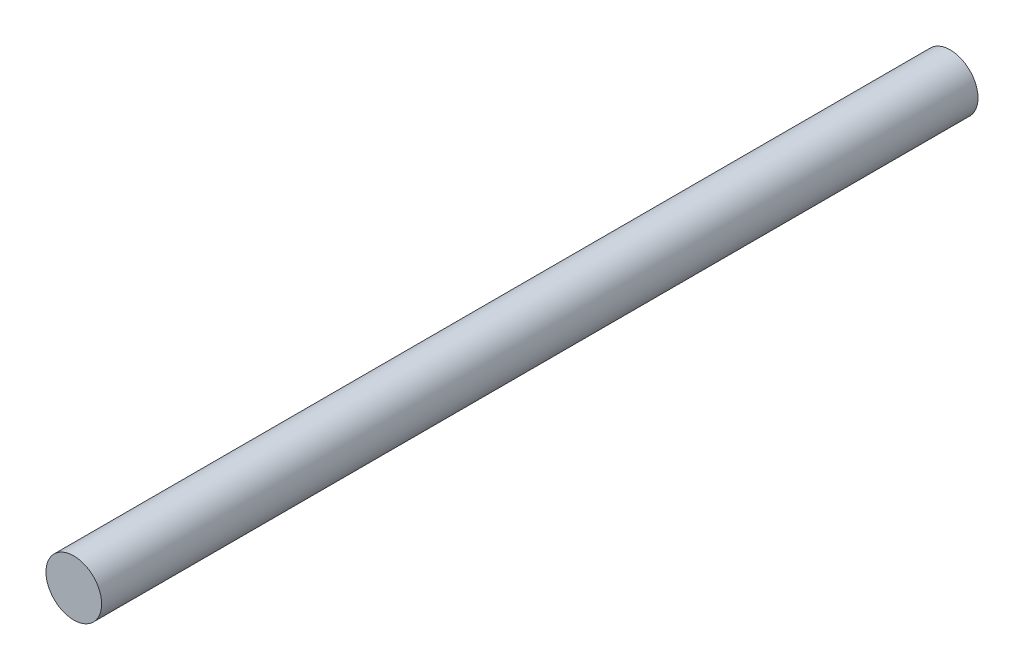
ISO-10303-21;
HEADER;
FILE_DESCRIPTION(('STEP AP214'),'2;1');
FILE_NAME('part.step','',(''),(''),'','','');
FILE_SCHEMA(('AUTOMOTIVE_DESIGN { 1 0 10303 214 1 1 1 1 }'));
ENDSEC;
DATA;
#1=APPLICATION_CONTEXT('core data for automotive mechanical design processes');
#2=APPLICATION_PROTOCOL_DEFINITION('international standard','automotive_design',2000,#1);
#3=PRODUCT_CONTEXT('',#1,'mechanical');
#4=PRODUCT('Part','Part','',(#3));
#5=PRODUCT_RELATED_PRODUCT_CATEGORY('part','',(#4));
#6=PRODUCT_DEFINITION_FORMATION('','',#4);
#7=PRODUCT_DEFINITION_CONTEXT('part definition',#1,'design');
#8=PRODUCT_DEFINITION('design','',#6,#7);
#9=PRODUCT_DEFINITION_SHAPE('','',#8);
#10=(LENGTH_UNIT() NAMED_UNIT(*) SI_UNIT(.MILLI.,.METRE.));
#11=(NAMED_UNIT(*) PLANE_ANGLE_UNIT() SI_UNIT($,.RADIAN.));
#12=(NAMED_UNIT(*) SI_UNIT($,.STERADIAN.) SOLID_ANGLE_UNIT());
#13=UNCERTAINTY_MEASURE_WITH_UNIT(LENGTH_MEASURE(1.E-05),#10,'distance_accuracy_value','');
#14=(GEOMETRIC_REPRESENTATION_CONTEXT(3) GLOBAL_UNCERTAINTY_ASSIGNED_CONTEXT((#13)) GLOBAL_UNIT_ASSIGNED_CONTEXT((#10,
#11,#12)) REPRESENTATION_CONTEXT('',''));
#15=CARTESIAN_POINT('',(0.,0.,0.));
#16=DIRECTION('',(0.,0.,1.));
#17=DIRECTION('',(1.,0.,0.));
#18=AXIS2_PLACEMENT_3D('',#15,#16,#17);
#19=CARTESIAN_POINT('',(0.,0.,63.));
#20=DIRECTION('',(0.,0.,-1.));
#21=DIRECTION('',(-1.,0.,0.));
#22=AXIS2_PLACEMENT_3D('',#19,#20,#21);
#23=CYLINDRICAL_SURFACE('',#22,2.);
#24=CARTESIAN_POINT('',(0.,0.,63.));
#25=DIRECTION('',(0.,0.,1.));
#26=DIRECTION('',(1.,0.,0.));
#27=AXIS2_PLACEMENT_3D('',#24,#25,#26);
#28=CIRCLE('',#27,2.);
#29=CARTESIAN_POINT('',(2.,0.,63.));
#30=VERTEX_POINT('',#29);
#31=EDGE_CURVE('E10',#30,#30,#28,.T.);
#32=ORIENTED_EDGE('',*,*,#31,.F.);
#33=EDGE_LOOP('',(#32));
#34=FACE_BOUND('',#33,.T.);
#35=CARTESIAN_POINT('',(0.,0.,0.));
#36=DIRECTION('',(0.,0.,1.));
#37=DIRECTION('',(1.,0.,0.));
#38=AXIS2_PLACEMENT_3D('',#35,#36,#37);
#39=CIRCLE('',#38,2.);
#40=CARTESIAN_POINT('',(2.,0.,0.));
#41=VERTEX_POINT('',#40);
#42=EDGE_CURVE('E44',#41,#41,#39,.T.);
#43=ORIENTED_EDGE('',*,*,#42,.T.);
#44=EDGE_LOOP('',(#43));
#45=FACE_BOUND('',#44,.T.);
#46=ADVANCED_FACE('F41',(#34,#45),#23,.T.);
#47=CARTESIAN_POINT('',(0.,0.,63.));
#48=DIRECTION('',(0.,0.,1.));
#49=DIRECTION('',(1.,0.,0.));
#50=AXIS2_PLACEMENT_3D('',#47,#48,#49);
#51=PLANE('',#50);
#52=ORIENTED_EDGE('',*,*,#31,.T.);
#53=EDGE_LOOP('',(#52));
#54=FACE_BOUND('',#53,.T.);
#55=ADVANCED_FACE('F58',(#54),#51,.T.);
#56=CARTESIAN_POINT('',(0.,0.,0.));
#57=DIRECTION('',(0.,0.,1.));
#58=DIRECTION('',(1.,0.,0.));
#59=AXIS2_PLACEMENT_3D('',#56,#57,#58);
#60=PLANE('',#59);
#61=ORIENTED_EDGE('',*,*,#42,.F.);
#62=EDGE_LOOP('',(#61));
#63=FACE_BOUND('',#62,.T.);
#64=ADVANCED_FACE('F56',(#63),#60,.F.);
#65=CLOSED_SHELL('',(#46,#55,#64));
#66=MANIFOLD_SOLID_BREP('B2',#65);
#67=ADVANCED_BREP_SHAPE_REPRESENTATION('',(#18,#66),#14);
#68=SHAPE_DEFINITION_REPRESENTATION(#9,#67);
ENDSEC;
END-ISO-10303-21;
